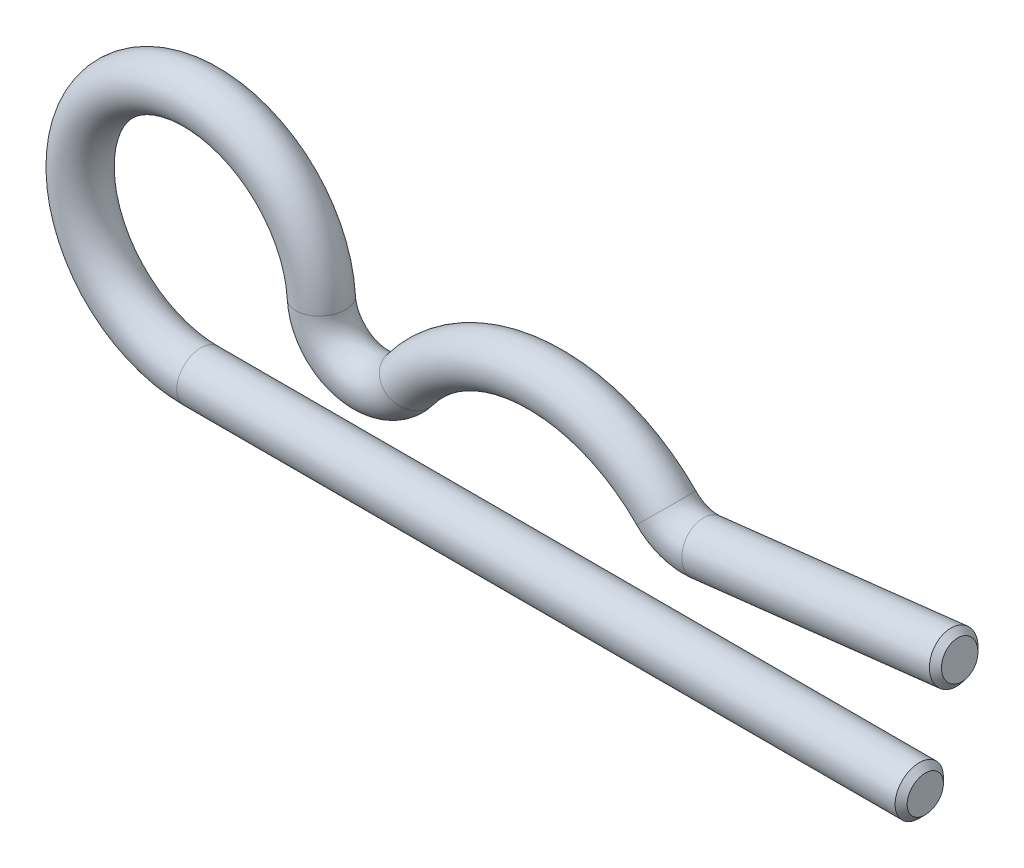
ISO-10303-21;
HEADER;
FILE_DESCRIPTION(('STEP AP214'),'2;1');
FILE_NAME('part.step','',(''),(''),'','','');
FILE_SCHEMA(('AUTOMOTIVE_DESIGN { 1 0 10303 214 1 1 1 1 }'));
ENDSEC;
DATA;
#1=APPLICATION_CONTEXT('core data for automotive mechanical design processes');
#2=APPLICATION_PROTOCOL_DEFINITION('international standard','automotive_design',2000,#1);
#3=PRODUCT_CONTEXT('',#1,'mechanical');
#4=PRODUCT('Part','Part','',(#3));
#5=PRODUCT_RELATED_PRODUCT_CATEGORY('part','',(#4));
#6=PRODUCT_DEFINITION_FORMATION('','',#4);
#7=PRODUCT_DEFINITION_CONTEXT('part definition',#1,'design');
#8=PRODUCT_DEFINITION('design','',#6,#7);
#9=PRODUCT_DEFINITION_SHAPE('','',#8);
#10=(LENGTH_UNIT() NAMED_UNIT(*) SI_UNIT(.MILLI.,.METRE.));
#11=(NAMED_UNIT(*) PLANE_ANGLE_UNIT() SI_UNIT($,.RADIAN.));
#12=(NAMED_UNIT(*) SI_UNIT($,.STERADIAN.) SOLID_ANGLE_UNIT());
#13=UNCERTAINTY_MEASURE_WITH_UNIT(LENGTH_MEASURE(1.E-05),#10,'distance_accuracy_value','');
#14=(GEOMETRIC_REPRESENTATION_CONTEXT(3) GLOBAL_UNCERTAINTY_ASSIGNED_CONTEXT((#13)) GLOBAL_UNIT_ASSIGNED_CONTEXT((#10,
#11,#12)) REPRESENTATION_CONTEXT('',''));
#15=CARTESIAN_POINT('',(0.,0.,0.));
#16=DIRECTION('',(0.,0.,1.));
#17=DIRECTION('',(1.,0.,0.));
#18=AXIS2_PLACEMENT_3D('',#15,#16,#17);
#19=CARTESIAN_POINT('',(5.,0.,0.));
#20=DIRECTION('',(-1.,0.,0.));
#21=DIRECTION('',(0.,-1.,0.));
#22=AXIS2_PLACEMENT_3D('',#19,#20,#21);
#23=PLANE('',#22);
#24=CARTESIAN_POINT('',(5.,0.,0.));
#25=DIRECTION('',(-1.,0.,0.));
#26=DIRECTION('',(0.,-1.,0.));
#27=AXIS2_PLACEMENT_3D('',#24,#25,#26);
#28=CIRCLE('',#27,0.749999999999994);
#29=CARTESIAN_POINT('',(5.,-0.749999999999994,0.));
#30=VERTEX_POINT('',#29);
#31=EDGE_CURVE('E11',#30,#30,#28,.F.);
#32=ORIENTED_EDGE('',*,*,#31,.T.);
#33=EDGE_LOOP('',(#32));
#34=FACE_BOUND('',#33,.T.);
#35=ADVANCED_FACE('F47',(#34),#23,.F.);
#36=CARTESIAN_POINT('',(6.42723542923775,5.52170522528136,0.));
#37=DIRECTION('',(0.993476070444081,0.114040771020664,0.));
#38=DIRECTION('',(-0.114040771020664,0.993476070444081,0.));
#39=AXIS2_PLACEMENT_3D('',#36,#37,#38);
#40=PLANE('',#39);
#41=CARTESIAN_POINT('',(6.42723542923775,5.52170522528136,0.));
#42=DIRECTION('',(0.993476070444081,0.114040771020664,0.));
#43=DIRECTION('',(-0.114040771020664,0.993476070444081,0.));
#44=AXIS2_PLACEMENT_3D('',#41,#42,#43);
#45=CIRCLE('',#44,0.750000000000001);
#46=CARTESIAN_POINT('',(6.34170485097225,6.26681227811443,0.));
#47=VERTEX_POINT('',#46);
#48=EDGE_CURVE('E62',#47,#47,#45,.T.);
#49=ORIENTED_EDGE('',*,*,#48,.T.);
#50=EDGE_LOOP('',(#49));
#51=FACE_BOUND('',#50,.T.);
#52=ADVANCED_FACE('F87',(#51),#40,.T.);
#53=CARTESIAN_POINT('',(5.,0.,0.));
#54=DIRECTION('',(-1.,0.,0.));
#55=DIRECTION('',(0.,-1.,0.));
#56=AXIS2_PLACEMENT_3D('',#53,#54,#55);
#57=CYLINDRICAL_SURFACE('',#56,1.);
#58=CARTESIAN_POINT('',(4.74999999999999,0.,0.));
#59=DIRECTION('',(-1.,0.,0.));
#60=DIRECTION('',(0.,-1.,0.));
#61=AXIS2_PLACEMENT_3D('',#58,#59,#60);
#62=CIRCLE('',#61,1.);
#63=CARTESIAN_POINT('',(4.74999999999999,-1.,0.));
#64=VERTEX_POINT('',#63);
#65=EDGE_CURVE('E54',#64,#64,#62,.T.);
#66=ORIENTED_EDGE('',*,*,#65,.T.);
#67=EDGE_LOOP('',(#66));
#68=FACE_BOUND('',#67,.T.);
#69=CARTESIAN_POINT('',(-25.,0.,0.));
#70=DIRECTION('',(-1.,0.,0.));
#71=DIRECTION('',(0.,-1.,0.));
#72=AXIS2_PLACEMENT_3D('',#69,#70,#71);
#73=CIRCLE('',#72,1.);
#74=CARTESIAN_POINT('',(-25.,-1.00000000000001,0.));
#75=VERTEX_POINT('',#74);
#76=EDGE_CURVE('E79',#75,#75,#73,.T.);
#77=ORIENTED_EDGE('',*,*,#76,.F.);
#78=EDGE_LOOP('',(#77));
#79=FACE_BOUND('',#78,.T.);
#80=ADVANCED_FACE('F85',(#68,#79),#57,.T.);
#81=CARTESIAN_POINT('',(-25.,4.99999999999999,0.));
#82=DIRECTION('',(0.,0.,-1.));
#83=DIRECTION('',(-1.,0.,0.));
#84=AXIS2_PLACEMENT_3D('',#81,#82,#83);
#85=TOROIDAL_SURFACE('',#84,5.,1.);
#86=CARTESIAN_POINT('',(-20.0090081146129,5.29999999999999,0.));
#87=DIRECTION('',(0.06,-0.998198377077422,0.));
#88=DIRECTION('',(0.998198377077422,0.06,0.));
#89=AXIS2_PLACEMENT_3D('',#86,#87,#88);
#90=CIRCLE('',#89,1.);
#91=CARTESIAN_POINT('',(-19.0108097375355,5.35999999999999,0.));
#92=VERTEX_POINT('',#91);
#93=EDGE_CURVE('E76',#92,#92,#90,.T.);
#94=CARTESIAN_POINT('',(-25.,4.99999999999999,0.));
#95=DIRECTION('',(0.,0.,-1.));
#96=DIRECTION('',(-1.,0.,0.));
#97=AXIS2_PLACEMENT_3D('',#94,#95,#96);
#98=CIRCLE('',#97,6.);
#99=EDGE_CURVE('',#75,#92,#98,.T.);
#100=ORIENTED_EDGE('',*,*,#76,.T.);
#101=ORIENTED_EDGE('',*,*,#93,.F.);
#102=ORIENTED_EDGE('',*,*,#99,.T.);
#103=ORIENTED_EDGE('',*,*,#99,.F.);
#104=EDGE_LOOP('',(#100,#102,#101,#103));
#105=FACE_BOUND('',#104,.T.);
#106=ADVANCED_FACE('F83',(#105),#85,.T.);
#107=CARTESIAN_POINT('',(-17.9660584917594,5.4227982134474,0.));
#108=DIRECTION('',(0.,0.,1.));
#109=DIRECTION('',(1.,0.,0.));
#110=AXIS2_PLACEMENT_3D('',#107,#108,#109);
#111=TOROIDAL_SURFACE('',#110,2.04663689079015,1.);
#112=CARTESIAN_POINT('',(-16.3278700592319,4.19598884672559,0.));
#113=DIRECTION('',(0.599426978103659,0.800429445936065,0.));
#114=DIRECTION('',(-0.800429445936065,0.599426978103659,0.));
#115=AXIS2_PLACEMENT_3D('',#112,#113,#114);
#116=CIRCLE('',#115,1.);
#117=CARTESIAN_POINT('',(-17.128299505168,4.79541582482925,0.));
#118=VERTEX_POINT('',#117);
#119=EDGE_CURVE('E73',#118,#118,#116,.T.);
#120=ORIENTED_EDGE('',*,*,#119,.F.);
#121=EDGE_LOOP('',(#120));
#122=FACE_BOUND('',#121,.T.);
#123=ORIENTED_EDGE('',*,*,#93,.T.);
#124=EDGE_LOOP('',(#123));
#125=FACE_BOUND('',#124,.T.);
#126=ADVANCED_FACE('F94',(#122,#125),#111,.T.);
#127=CARTESIAN_POINT('',(-10.7248639376794,0.,0.));
#128=DIRECTION('',(0.,0.,-1.));
#129=DIRECTION('',(-1.,0.,0.));
#130=AXIS2_PLACEMENT_3D('',#127,#128,#129);
#131=TOROIDAL_SURFACE('',#130,7.,1.);
#132=CARTESIAN_POINT('',(-5.72842893709791,4.90261535152043,0.));
#133=DIRECTION('',(0.700373621645777,-0.713776428654504,0.));
#134=DIRECTION('',(0.713776428654504,0.700373621645777,0.));
#135=AXIS2_PLACEMENT_3D('',#132,#133,#134);
#136=CIRCLE('',#135,1.);
#137=CARTESIAN_POINT('',(-5.01465250844341,5.60298897316621,0.));
#138=VERTEX_POINT('',#137);
#139=EDGE_CURVE('E70',#138,#138,#136,.T.);
#140=CARTESIAN_POINT('',(-10.7248639376794,0.,0.));
#141=DIRECTION('',(0.,0.,-1.));
#142=DIRECTION('',(-1.,0.,0.));
#143=AXIS2_PLACEMENT_3D('',#140,#141,#142);
#144=CIRCLE('',#143,8.);
#145=EDGE_CURVE('',#118,#138,#144,.T.);
#146=ORIENTED_EDGE('',*,*,#119,.T.);
#147=ORIENTED_EDGE('',*,*,#139,.F.);
#148=ORIENTED_EDGE('',*,*,#145,.T.);
#149=ORIENTED_EDGE('',*,*,#145,.F.);
#150=EDGE_LOOP('',(#146,#148,#147,#149));
#151=FACE_BOUND('',#150,.T.);
#152=ADVANCED_FACE('F109',(#151),#131,.T.);
#153=CARTESIAN_POINT('',(-4.3008760797889,6.30336259481198,0.));
#154=DIRECTION('',(0.,0.,1.));
#155=DIRECTION('',(1.,0.,0.));
#156=AXIS2_PLACEMENT_3D('',#153,#154,#155);
#157=TOROIDAL_SURFACE('',#156,2.,1.);
#158=CARTESIAN_POINT('',(-4.07279453774757,4.31641045392382,0.));
#159=DIRECTION('',(0.993476070444081,0.114040771020665,0.));
#160=DIRECTION('',(-0.114040771020665,0.993476070444081,0.));
#161=AXIS2_PLACEMENT_3D('',#158,#159,#160);
#162=CIRCLE('',#161,1.);
#163=CARTESIAN_POINT('',(-4.18683530876824,5.3098865243679,0.));
#164=VERTEX_POINT('',#163);
#165=EDGE_CURVE('E67',#164,#164,#162,.T.);
#166=ORIENTED_EDGE('',*,*,#165,.F.);
#167=EDGE_LOOP('',(#166));
#168=FACE_BOUND('',#167,.T.);
#169=ORIENTED_EDGE('',*,*,#139,.T.);
#170=EDGE_LOOP('',(#169));
#171=FACE_BOUND('',#170,.T.);
#172=ADVANCED_FACE('F101',(#168,#171),#157,.T.);
#173=CARTESIAN_POINT('',(-4.07279453774757,4.31641045392382,0.));
#174=DIRECTION('',(0.993476070444081,0.114040771020664,0.));
#175=DIRECTION('',(-0.114040771020664,0.993476070444081,0.));
#176=AXIS2_PLACEMENT_3D('',#173,#174,#175);
#177=CYLINDRICAL_SURFACE('',#176,1.);
#178=CARTESIAN_POINT('',(6.17886641162672,5.4931950325262,0.));
#179=DIRECTION('',(0.993476070444081,0.114040771020663,0.));
#180=DIRECTION('',(-0.114040771020663,0.993476070444081,0.));
#181=AXIS2_PLACEMENT_3D('',#178,#179,#180);
#182=CIRCLE('',#181,1.);
#183=CARTESIAN_POINT('',(6.06482564060606,6.48667110297028,0.));
#184=VERTEX_POINT('',#183);
#185=EDGE_CURVE('E58',#184,#184,#182,.F.);
#186=ORIENTED_EDGE('',*,*,#185,.T.);
#187=EDGE_LOOP('',(#186));
#188=FACE_BOUND('',#187,.T.);
#189=ORIENTED_EDGE('',*,*,#165,.T.);
#190=EDGE_LOOP('',(#189));
#191=FACE_BOUND('',#190,.T.);
#192=ADVANCED_FACE('F99',(#188,#191),#177,.T.);
#193=CARTESIAN_POINT('',(6.42723542923775,5.52170522528136,0.));
#194=DIRECTION('',(-0.993476070444081,-0.114040771020663,0.));
#195=DIRECTION('',(0.114040771020663,-0.993476070444081,0.));
#196=AXIS2_PLACEMENT_3D('',#193,#194,#195);
#197=CONICAL_SURFACE('',#196,0.749999999999999,0.785398163397434);
#198=ORIENTED_EDGE('',*,*,#185,.F.);
#199=EDGE_LOOP('',(#198));
#200=FACE_BOUND('',#199,.T.);
#201=ORIENTED_EDGE('',*,*,#48,.F.);
#202=EDGE_LOOP('',(#201));
#203=FACE_BOUND('',#202,.T.);
#204=ADVANCED_FACE('F100',(#200,#203),#197,.T.);
#205=CARTESIAN_POINT('',(4.74999999999999,0.,0.));
#206=DIRECTION('',(-1.,0.,0.));
#207=DIRECTION('',(0.,-1.,0.));
#208=AXIS2_PLACEMENT_3D('',#205,#206,#207);
#209=CONICAL_SURFACE('',#208,1.,0.785398163397449);
#210=ORIENTED_EDGE('',*,*,#31,.F.);
#211=EDGE_LOOP('',(#210));
#212=FACE_BOUND('',#211,.T.);
#213=ORIENTED_EDGE('',*,*,#65,.F.);
#214=EDGE_LOOP('',(#213));
#215=FACE_BOUND('',#214,.T.);
#216=ADVANCED_FACE('F49',(#212,#215),#209,.T.);
#217=CLOSED_SHELL('',(#35,#52,#80,#106,#126,#152,#172,#192,#204,#216));
#218=MANIFOLD_SOLID_BREP('B2',#217);
#219=ADVANCED_BREP_SHAPE_REPRESENTATION('',(#18,#218),#14);
#220=SHAPE_DEFINITION_REPRESENTATION(#9,#219);
ENDSEC;
END-ISO-10303-21;
